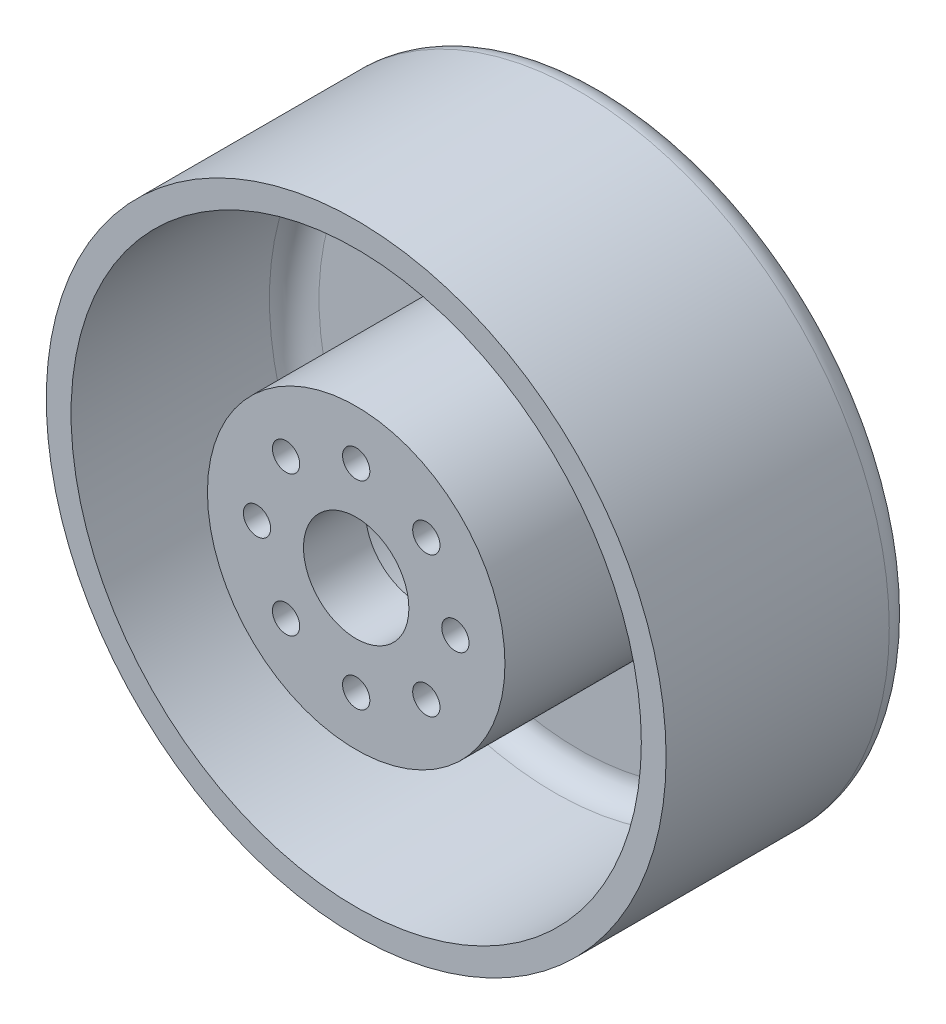
ISO-10303-21;
HEADER;
FILE_DESCRIPTION(('STEP AP214'),'2;1');
FILE_NAME('part.step','',(''),(''),'','','');
FILE_SCHEMA(('AUTOMOTIVE_DESIGN { 1 0 10303 214 1 1 1 1 }'));
ENDSEC;
DATA;
#1=APPLICATION_CONTEXT('core data for automotive mechanical design processes');
#2=APPLICATION_PROTOCOL_DEFINITION('international standard','automotive_design',2000,#1);
#3=PRODUCT_CONTEXT('',#1,'mechanical');
#4=PRODUCT('Part','Part','',(#3));
#5=PRODUCT_RELATED_PRODUCT_CATEGORY('part','',(#4));
#6=PRODUCT_DEFINITION_FORMATION('','',#4);
#7=PRODUCT_DEFINITION_CONTEXT('part definition',#1,'design');
#8=PRODUCT_DEFINITION('design','',#6,#7);
#9=PRODUCT_DEFINITION_SHAPE('','',#8);
#10=(LENGTH_UNIT() NAMED_UNIT(*) SI_UNIT(.MILLI.,.METRE.));
#11=(NAMED_UNIT(*) PLANE_ANGLE_UNIT() SI_UNIT($,.RADIAN.));
#12=(NAMED_UNIT(*) SI_UNIT($,.STERADIAN.) SOLID_ANGLE_UNIT());
#13=UNCERTAINTY_MEASURE_WITH_UNIT(LENGTH_MEASURE(1.E-05),#10,'distance_accuracy_value','');
#14=(GEOMETRIC_REPRESENTATION_CONTEXT(3) GLOBAL_UNCERTAINTY_ASSIGNED_CONTEXT((#13)) GLOBAL_UNIT_ASSIGNED_CONTEXT((#10,
#11,#12)) REPRESENTATION_CONTEXT('',''));
#15=CARTESIAN_POINT('',(0.,0.,0.));
#16=DIRECTION('',(0.,0.,1.));
#17=DIRECTION('',(1.,0.,0.));
#18=AXIS2_PLACEMENT_3D('',#15,#16,#17);
#19=CARTESIAN_POINT('',(0.,0.,20.));
#20=DIRECTION('',(0.,0.,1.));
#21=DIRECTION('',(1.,0.,0.));
#22=AXIS2_PLACEMENT_3D('',#19,#20,#21);
#23=PLANE('',#22);
#24=CARTESIAN_POINT('',(0.,0.,20.));
#25=DIRECTION('',(0.,0.,1.));
#26=DIRECTION('',(1.,0.,0.));
#27=AXIS2_PLACEMENT_3D('',#24,#25,#26);
#28=CIRCLE('',#27,4.25);
#29=CARTESIAN_POINT('',(4.25,0.,20.));
#30=VERTEX_POINT('',#29);
#31=EDGE_CURVE('E216',#30,#30,#28,.T.);
#32=ORIENTED_EDGE('',*,*,#31,.F.);
#33=EDGE_LOOP('',(#32));
#34=FACE_BOUND('',#33,.T.);
#35=CARTESIAN_POINT('',(5.65685424949228,5.65685424949214,20.));
#36=DIRECTION('',(0.,0.,-1.));
#37=DIRECTION('',(-1.,0.,0.));
#38=AXIS2_PLACEMENT_3D('',#35,#36,#37);
#39=CIRCLE('',#38,1.1);
#40=CARTESIAN_POINT('',(4.55685424949228,5.65685424949214,20.));
#41=VERTEX_POINT('',#40);
#42=EDGE_CURVE('E76',#41,#41,#39,.T.);
#43=ORIENTED_EDGE('',*,*,#42,.T.);
#44=EDGE_LOOP('',(#43));
#45=FACE_BOUND('',#44,.T.);
#46=CARTESIAN_POINT('',(7.99999999999966,-3.40570654445189E-13,20.));
#47=DIRECTION('',(0.,0.,-1.));
#48=DIRECTION('',(-1.,0.,0.));
#49=AXIS2_PLACEMENT_3D('',#46,#47,#48);
#50=CIRCLE('',#49,1.1);
#51=CARTESIAN_POINT('',(6.89999999999966,-3.40570654445189E-13,20.));
#52=VERTEX_POINT('',#51);
#53=EDGE_CURVE('E92',#52,#52,#50,.T.);
#54=ORIENTED_EDGE('',*,*,#53,.T.);
#55=EDGE_LOOP('',(#54));
#56=FACE_BOUND('',#55,.T.);
#57=CARTESIAN_POINT('',(5.6568542494918,-5.65685424949262,20.));
#58=DIRECTION('',(0.,0.,-1.));
#59=DIRECTION('',(-1.,0.,0.));
#60=AXIS2_PLACEMENT_3D('',#57,#58,#59);
#61=CIRCLE('',#60,1.1);
#62=CARTESIAN_POINT('',(4.5568542494918,-5.65685424949262,20.));
#63=VERTEX_POINT('',#62);
#64=EDGE_CURVE('E108',#63,#63,#61,.T.);
#65=ORIENTED_EDGE('',*,*,#64,.T.);
#66=EDGE_LOOP('',(#65));
#67=FACE_BOUND('',#66,.T.);
#68=CARTESIAN_POINT('',(-6.79181874011743E-13,-8.,20.));
#69=DIRECTION('',(0.,0.,-1.));
#70=DIRECTION('',(-1.,0.,0.));
#71=AXIS2_PLACEMENT_3D('',#68,#69,#70);
#72=CIRCLE('',#71,1.1);
#73=CARTESIAN_POINT('',(-1.10000000000068,-8.,20.));
#74=VERTEX_POINT('',#73);
#75=EDGE_CURVE('E124',#74,#74,#72,.T.);
#76=ORIENTED_EDGE('',*,*,#75,.T.);
#77=EDGE_LOOP('',(#76));
#78=FACE_BOUND('',#77,.T.);
#79=CARTESIAN_POINT('',(-5.65685424949296,-5.65685424949214,20.));
#80=DIRECTION('',(0.,0.,-1.));
#81=DIRECTION('',(-1.,0.,0.));
#82=AXIS2_PLACEMENT_3D('',#79,#80,#81);
#83=CIRCLE('',#82,1.1);
#84=CARTESIAN_POINT('',(-6.75685424949296,-5.65685424949214,20.));
#85=VERTEX_POINT('',#84);
#86=EDGE_CURVE('E140',#85,#85,#83,.T.);
#87=ORIENTED_EDGE('',*,*,#86,.T.);
#88=EDGE_LOOP('',(#87));
#89=FACE_BOUND('',#88,.T.);
#90=CARTESIAN_POINT('',(-8.00000000000034,3.39590937005871E-13,20.));
#91=DIRECTION('',(0.,0.,-1.));
#92=DIRECTION('',(-1.,0.,0.));
#93=AXIS2_PLACEMENT_3D('',#90,#91,#92);
#94=CIRCLE('',#93,1.1);
#95=CARTESIAN_POINT('',(-9.10000000000034,3.39590937005871E-13,20.));
#96=VERTEX_POINT('',#95);
#97=EDGE_CURVE('E156',#96,#96,#94,.T.);
#98=ORIENTED_EDGE('',*,*,#97,.T.);
#99=EDGE_LOOP('',(#98));
#100=FACE_BOUND('',#99,.T.);
#101=CARTESIAN_POINT('',(-5.65685424949248,5.65685424949262,20.));
#102=DIRECTION('',(0.,0.,-1.));
#103=DIRECTION('',(-1.,0.,0.));
#104=AXIS2_PLACEMENT_3D('',#101,#102,#103);
#105=CIRCLE('',#104,1.1);
#106=CARTESIAN_POINT('',(-6.75685424949248,5.65685424949262,20.));
#107=VERTEX_POINT('',#106);
#108=EDGE_CURVE('E172',#107,#107,#105,.T.);
#109=ORIENTED_EDGE('',*,*,#108,.T.);
#110=EDGE_LOOP('',(#109));
#111=FACE_BOUND('',#110,.T.);
#112=CARTESIAN_POINT('',(0.,8.,20.));
#113=DIRECTION('',(0.,0.,-1.));
#114=DIRECTION('',(-1.,0.,0.));
#115=AXIS2_PLACEMENT_3D('',#112,#113,#114);
#116=CIRCLE('',#115,1.1);
#117=CARTESIAN_POINT('',(-1.1,8.,20.));
#118=VERTEX_POINT('',#117);
#119=EDGE_CURVE('E188',#118,#118,#116,.T.);
#120=ORIENTED_EDGE('',*,*,#119,.T.);
#121=EDGE_LOOP('',(#120));
#122=FACE_BOUND('',#121,.T.);
#123=CARTESIAN_POINT('',(0.,0.,20.));
#124=DIRECTION('',(0.,0.,1.));
#125=DIRECTION('',(1.,0.,0.));
#126=AXIS2_PLACEMENT_3D('',#123,#124,#125);
#127=CIRCLE('',#126,12.);
#128=CARTESIAN_POINT('',(12.,0.,20.));
#129=VERTEX_POINT('',#128);
#130=EDGE_CURVE('E209',#129,#129,#127,.T.);
#131=ORIENTED_EDGE('',*,*,#130,.T.);
#132=EDGE_LOOP('',(#131));
#133=FACE_BOUND('',#132,.T.);
#134=ADVANCED_FACE('F36',(#34,#45,#56,#67,#78,#89,#100,#111,#122,#133),#23,.T.);
#135=CARTESIAN_POINT('',(0.,0.,20.));
#136=DIRECTION('',(0.,0.,-1.));
#137=DIRECTION('',(-1.,0.,0.));
#138=AXIS2_PLACEMENT_3D('',#135,#136,#137);
#139=CYLINDRICAL_SURFACE('',#138,25.);
#140=CARTESIAN_POINT('',(0.,0.,2.));
#141=DIRECTION('',(0.,0.,1.));
#142=DIRECTION('',(1.,0.,0.));
#143=AXIS2_PLACEMENT_3D('',#140,#141,#142);
#144=CIRCLE('',#143,25.);
#145=CARTESIAN_POINT('',(25.,0.,2.));
#146=VERTEX_POINT('',#145);
#147=EDGE_CURVE('E50',#146,#146,#144,.T.);
#148=ORIENTED_EDGE('',*,*,#147,.T.);
#149=EDGE_LOOP('',(#148));
#150=FACE_BOUND('',#149,.T.);
#151=CARTESIAN_POINT('',(0.,0.,20.));
#152=DIRECTION('',(0.,0.,1.));
#153=DIRECTION('',(1.,0.,0.));
#154=AXIS2_PLACEMENT_3D('',#151,#152,#153);
#155=CIRCLE('',#154,25.);
#156=CARTESIAN_POINT('',(25.,0.,20.));
#157=VERTEX_POINT('',#156);
#158=EDGE_CURVE('E68',#157,#157,#155,.T.);
#159=ORIENTED_EDGE('',*,*,#158,.F.);
#160=EDGE_LOOP('',(#159));
#161=FACE_BOUND('',#160,.T.);
#162=ADVANCED_FACE('F264',(#150,#161),#139,.T.);
#163=CARTESIAN_POINT('',(0.,0.,20.));
#164=DIRECTION('',(0.,0.,1.));
#165=DIRECTION('',(1.,0.,0.));
#166=AXIS2_PLACEMENT_3D('',#163,#164,#165);
#167=CIRCLE('',#166,23.);
#168=CARTESIAN_POINT('',(23.,0.,20.));
#169=VERTEX_POINT('',#168);
#170=EDGE_CURVE('E204',#169,#169,#167,.T.);
#171=ORIENTED_EDGE('',*,*,#170,.F.);
#172=EDGE_LOOP('',(#171));
#173=FACE_BOUND('',#172,.T.);
#174=ORIENTED_EDGE('',*,*,#158,.T.);
#175=EDGE_LOOP('',(#174));
#176=FACE_BOUND('',#175,.T.);
#177=ADVANCED_FACE('F259',(#173,#176),#23,.T.);
#178=CARTESIAN_POINT('',(0.,0.,0.));
#179=DIRECTION('',(0.,0.,1.));
#180=DIRECTION('',(1.,0.,0.));
#181=AXIS2_PLACEMENT_3D('',#178,#179,#180);
#182=PLANE('',#181);
#183=CARTESIAN_POINT('',(0.,0.,0.));
#184=DIRECTION('',(0.,0.,1.));
#185=DIRECTION('',(1.,0.,0.));
#186=AXIS2_PLACEMENT_3D('',#183,#184,#185);
#187=CIRCLE('',#186,13.);
#188=CARTESIAN_POINT('',(13.,0.,0.));
#189=VERTEX_POINT('',#188);
#190=EDGE_CURVE('E56',#189,#189,#187,.T.);
#191=ORIENTED_EDGE('',*,*,#190,.T.);
#192=EDGE_LOOP('',(#191));
#193=FACE_BOUND('',#192,.T.);
#194=CARTESIAN_POINT('',(0.,0.,0.));
#195=DIRECTION('',(0.,0.,1.));
#196=DIRECTION('',(1.,0.,0.));
#197=AXIS2_PLACEMENT_3D('',#194,#195,#196);
#198=CIRCLE('',#197,23.);
#199=CARTESIAN_POINT('',(23.,0.,0.));
#200=VERTEX_POINT('',#199);
#201=EDGE_CURVE('E60',#200,#200,#198,.F.);
#202=ORIENTED_EDGE('',*,*,#201,.T.);
#203=EDGE_LOOP('',(#202));
#204=FACE_BOUND('',#203,.T.);
#205=ADVANCED_FACE('F252',(#193,#204),#182,.F.);
#206=CARTESIAN_POINT('',(0.,0.,15.));
#207=DIRECTION('',(0.,0.,-1.));
#208=DIRECTION('',(-1.,0.,0.));
#209=AXIS2_PLACEMENT_3D('',#206,#207,#208);
#210=CYLINDRICAL_SURFACE('',#209,11.);
#211=CARTESIAN_POINT('',(0.,0.,2.));
#212=DIRECTION('',(0.,0.,1.));
#213=DIRECTION('',(1.,0.,0.));
#214=AXIS2_PLACEMENT_3D('',#211,#212,#213);
#215=CIRCLE('',#214,11.);
#216=CARTESIAN_POINT('',(11.,0.,2.));
#217=VERTEX_POINT('',#216);
#218=EDGE_CURVE('E64',#217,#217,#215,.F.);
#219=ORIENTED_EDGE('',*,*,#218,.T.);
#220=EDGE_LOOP('',(#219));
#221=FACE_BOUND('',#220,.T.);
#222=CARTESIAN_POINT('',(0.,0.,15.));
#223=DIRECTION('',(0.,0.,-1.));
#224=DIRECTION('',(-1.,0.,0.));
#225=AXIS2_PLACEMENT_3D('',#222,#223,#224);
#226=CIRCLE('',#225,11.);
#227=CARTESIAN_POINT('',(-11.,0.,15.));
#228=VERTEX_POINT('',#227);
#229=EDGE_CURVE('E72',#228,#228,#226,.T.);
#230=ORIENTED_EDGE('',*,*,#229,.F.);
#231=EDGE_LOOP('',(#230));
#232=FACE_BOUND('',#231,.T.);
#233=ADVANCED_FACE('F231',(#221,#232),#210,.F.);
#234=CARTESIAN_POINT('',(0.,0.,15.));
#235=DIRECTION('',(0.,0.,-1.));
#236=DIRECTION('',(-1.,0.,0.));
#237=AXIS2_PLACEMENT_3D('',#234,#235,#236);
#238=PLANE('',#237);
#239=CARTESIAN_POINT('',(0.,0.,15.));
#240=DIRECTION('',(0.,0.,-1.));
#241=DIRECTION('',(-1.,0.,0.));
#242=AXIS2_PLACEMENT_3D('',#239,#240,#241);
#243=CIRCLE('',#242,4.25);
#244=CARTESIAN_POINT('',(-4.25,0.,15.));
#245=VERTEX_POINT('',#244);
#246=EDGE_CURVE('E40',#245,#245,#243,.T.);
#247=ORIENTED_EDGE('',*,*,#246,.F.);
#248=EDGE_LOOP('',(#247));
#249=FACE_BOUND('',#248,.T.);
#250=CARTESIAN_POINT('',(0.,8.,15.));
#251=DIRECTION('',(0.,0.,-1.));
#252=DIRECTION('',(-1.,0.,0.));
#253=AXIS2_PLACEMENT_3D('',#250,#251,#252);
#254=CIRCLE('',#253,2.19999999999999);
#255=CARTESIAN_POINT('',(-2.19999999999999,8.,15.));
#256=VERTEX_POINT('',#255);
#257=EDGE_CURVE('E200',#256,#256,#254,.T.);
#258=ORIENTED_EDGE('',*,*,#257,.F.);
#259=EDGE_LOOP('',(#258));
#260=FACE_BOUND('',#259,.T.);
#261=CARTESIAN_POINT('',(-5.65685424949248,5.65685424949262,15.));
#262=DIRECTION('',(0.,0.,-1.));
#263=DIRECTION('',(-1.,0.,0.));
#264=AXIS2_PLACEMENT_3D('',#261,#262,#263);
#265=CIRCLE('',#264,2.19999999999999);
#266=CARTESIAN_POINT('',(-7.85685424949247,5.65685424949262,15.));
#267=VERTEX_POINT('',#266);
#268=EDGE_CURVE('E184',#267,#267,#265,.T.);
#269=ORIENTED_EDGE('',*,*,#268,.F.);
#270=EDGE_LOOP('',(#269));
#271=FACE_BOUND('',#270,.T.);
#272=CARTESIAN_POINT('',(-8.00000000000034,3.39590937005871E-13,15.));
#273=DIRECTION('',(0.,0.,-1.));
#274=DIRECTION('',(-1.,0.,0.));
#275=AXIS2_PLACEMENT_3D('',#272,#273,#274);
#276=CIRCLE('',#275,2.19999999999999);
#277=CARTESIAN_POINT('',(-10.2000000000003,3.39590937005871E-13,15.));
#278=VERTEX_POINT('',#277);
#279=EDGE_CURVE('E168',#278,#278,#276,.T.);
#280=ORIENTED_EDGE('',*,*,#279,.F.);
#281=EDGE_LOOP('',(#280));
#282=FACE_BOUND('',#281,.T.);
#283=CARTESIAN_POINT('',(-5.65685424949296,-5.65685424949214,15.));
#284=DIRECTION('',(0.,0.,-1.));
#285=DIRECTION('',(-1.,0.,0.));
#286=AXIS2_PLACEMENT_3D('',#283,#284,#285);
#287=CIRCLE('',#286,2.19999999999999);
#288=CARTESIAN_POINT('',(-7.85685424949295,-5.65685424949214,15.));
#289=VERTEX_POINT('',#288);
#290=EDGE_CURVE('E152',#289,#289,#287,.T.);
#291=ORIENTED_EDGE('',*,*,#290,.F.);
#292=EDGE_LOOP('',(#291));
#293=FACE_BOUND('',#292,.T.);
#294=CARTESIAN_POINT('',(-6.79181874011743E-13,-8.,15.));
#295=DIRECTION('',(0.,0.,-1.));
#296=DIRECTION('',(-1.,0.,0.));
#297=AXIS2_PLACEMENT_3D('',#294,#295,#296);
#298=CIRCLE('',#297,2.19999999999999);
#299=CARTESIAN_POINT('',(-2.20000000000067,-8.,15.));
#300=VERTEX_POINT('',#299);
#301=EDGE_CURVE('E136',#300,#300,#298,.T.);
#302=ORIENTED_EDGE('',*,*,#301,.F.);
#303=EDGE_LOOP('',(#302));
#304=FACE_BOUND('',#303,.T.);
#305=CARTESIAN_POINT('',(5.6568542494918,-5.65685424949262,15.));
#306=DIRECTION('',(0.,0.,-1.));
#307=DIRECTION('',(-1.,0.,0.));
#308=AXIS2_PLACEMENT_3D('',#305,#306,#307);
#309=CIRCLE('',#308,2.19999999999999);
#310=CARTESIAN_POINT('',(3.45685424949181,-5.65685424949262,15.));
#311=VERTEX_POINT('',#310);
#312=EDGE_CURVE('E120',#311,#311,#309,.T.);
#313=ORIENTED_EDGE('',*,*,#312,.F.);
#314=EDGE_LOOP('',(#313));
#315=FACE_BOUND('',#314,.T.);
#316=CARTESIAN_POINT('',(7.99999999999966,-3.40570654445189E-13,15.));
#317=DIRECTION('',(0.,0.,-1.));
#318=DIRECTION('',(-1.,0.,0.));
#319=AXIS2_PLACEMENT_3D('',#316,#317,#318);
#320=CIRCLE('',#319,2.19999999999999);
#321=CARTESIAN_POINT('',(5.79999999999967,-3.40570654445189E-13,15.));
#322=VERTEX_POINT('',#321);
#323=EDGE_CURVE('E104',#322,#322,#320,.T.);
#324=ORIENTED_EDGE('',*,*,#323,.F.);
#325=EDGE_LOOP('',(#324));
#326=FACE_BOUND('',#325,.T.);
#327=CARTESIAN_POINT('',(5.65685424949228,5.65685424949214,15.));
#328=DIRECTION('',(0.,0.,-1.));
#329=DIRECTION('',(-1.,0.,0.));
#330=AXIS2_PLACEMENT_3D('',#327,#328,#329);
#331=CIRCLE('',#330,2.19999999999999);
#332=CARTESIAN_POINT('',(3.45685424949229,5.65685424949214,15.));
#333=VERTEX_POINT('',#332);
#334=EDGE_CURVE('E88',#333,#333,#331,.T.);
#335=ORIENTED_EDGE('',*,*,#334,.F.);
#336=EDGE_LOOP('',(#335));
#337=FACE_BOUND('',#336,.T.);
#338=ORIENTED_EDGE('',*,*,#229,.T.);
#339=EDGE_LOOP('',(#338));
#340=FACE_BOUND('',#339,.T.);
#341=ADVANCED_FACE('F227',(#249,#260,#271,#282,#293,#304,#315,#326,#337,#340),#238,.T.);
#342=CARTESIAN_POINT('',(5.65685424949228,5.65685424949214,15.));
#343=DIRECTION('',(0.,0.,-1.));
#344=DIRECTION('',(-1.,0.,0.));
#345=AXIS2_PLACEMENT_3D('',#342,#343,#344);
#346=CYLINDRICAL_SURFACE('',#345,1.10000000000001);
#347=ORIENTED_EDGE('',*,*,#42,.F.);
#348=EDGE_LOOP('',(#347));
#349=FACE_BOUND('',#348,.T.);
#350=CARTESIAN_POINT('',(5.65685424949228,5.65685424949214,17.));
#351=DIRECTION('',(0.,0.,-1.));
#352=DIRECTION('',(-1.,0.,0.));
#353=AXIS2_PLACEMENT_3D('',#350,#351,#352);
#354=CIRCLE('',#353,1.10000000000001);
#355=CARTESIAN_POINT('',(4.55685424949227,5.65685424949214,17.));
#356=VERTEX_POINT('',#355);
#357=EDGE_CURVE('E80',#356,#356,#354,.T.);
#358=ORIENTED_EDGE('',*,*,#357,.T.);
#359=EDGE_LOOP('',(#358));
#360=FACE_BOUND('',#359,.T.);
#361=ADVANCED_FACE('F230',(#349,#360),#346,.F.);
#362=CARTESIAN_POINT('',(6.75685424949229,5.65685424949214,17.));
#363=DIRECTION('',(0.,0.,1.));
#364=DIRECTION('',(1.,0.,0.));
#365=AXIS2_PLACEMENT_3D('',#362,#363,#364);
#366=PLANE('',#365);
#367=ORIENTED_EDGE('',*,*,#357,.F.);
#368=EDGE_LOOP('',(#367));
#369=FACE_BOUND('',#368,.T.);
#370=CARTESIAN_POINT('',(5.65685424949228,5.65685424949214,17.));
#371=DIRECTION('',(0.,0.,-1.));
#372=DIRECTION('',(-1.,0.,0.));
#373=AXIS2_PLACEMENT_3D('',#370,#371,#372);
#374=CIRCLE('',#373,2.19999999999999);
#375=CARTESIAN_POINT('',(3.45685424949229,5.65685424949214,17.));
#376=VERTEX_POINT('',#375);
#377=EDGE_CURVE('E84',#376,#376,#374,.T.);
#378=ORIENTED_EDGE('',*,*,#377,.T.);
#379=EDGE_LOOP('',(#378));
#380=FACE_BOUND('',#379,.T.);
#381=ADVANCED_FACE('F383',(#369,#380),#366,.F.);
#382=CARTESIAN_POINT('',(5.65685424949228,5.65685424949214,15.));
#383=DIRECTION('',(0.,0.,-1.));
#384=DIRECTION('',(-1.,0.,0.));
#385=AXIS2_PLACEMENT_3D('',#382,#383,#384);
#386=CYLINDRICAL_SURFACE('',#385,2.19999999999999);
#387=ORIENTED_EDGE('',*,*,#377,.F.);
#388=EDGE_LOOP('',(#387));
#389=FACE_BOUND('',#388,.T.);
#390=ORIENTED_EDGE('',*,*,#334,.T.);
#391=EDGE_LOOP('',(#390));
#392=FACE_BOUND('',#391,.T.);
#393=ADVANCED_FACE('F379',(#389,#392),#386,.F.);
#394=CARTESIAN_POINT('',(7.99999999999966,-3.40570654445189E-13,15.));
#395=DIRECTION('',(0.,0.,-1.));
#396=DIRECTION('',(-1.,0.,0.));
#397=AXIS2_PLACEMENT_3D('',#394,#395,#396);
#398=CYLINDRICAL_SURFACE('',#397,1.10000000000001);
#399=ORIENTED_EDGE('',*,*,#53,.F.);
#400=EDGE_LOOP('',(#399));
#401=FACE_BOUND('',#400,.T.);
#402=CARTESIAN_POINT('',(7.99999999999966,-3.40570654445189E-13,17.));
#403=DIRECTION('',(0.,0.,-1.));
#404=DIRECTION('',(-1.,0.,0.));
#405=AXIS2_PLACEMENT_3D('',#402,#403,#404);
#406=CIRCLE('',#405,1.10000000000001);
#407=CARTESIAN_POINT('',(6.89999999999965,-3.40570654445189E-13,17.));
#408=VERTEX_POINT('',#407);
#409=EDGE_CURVE('E96',#408,#408,#406,.T.);
#410=ORIENTED_EDGE('',*,*,#409,.T.);
#411=EDGE_LOOP('',(#410));
#412=FACE_BOUND('',#411,.T.);
#413=ADVANCED_FACE('F375',(#401,#412),#398,.F.);
#414=CARTESIAN_POINT('',(9.09999999999967,-3.40570654445189E-13,17.));
#415=DIRECTION('',(0.,0.,1.));
#416=DIRECTION('',(1.,0.,0.));
#417=AXIS2_PLACEMENT_3D('',#414,#415,#416);
#418=PLANE('',#417);
#419=ORIENTED_EDGE('',*,*,#409,.F.);
#420=EDGE_LOOP('',(#419));
#421=FACE_BOUND('',#420,.T.);
#422=CARTESIAN_POINT('',(7.99999999999966,-3.40570654445189E-13,17.));
#423=DIRECTION('',(0.,0.,-1.));
#424=DIRECTION('',(-1.,0.,0.));
#425=AXIS2_PLACEMENT_3D('',#422,#423,#424);
#426=CIRCLE('',#425,2.19999999999999);
#427=CARTESIAN_POINT('',(5.79999999999967,-3.40570654445189E-13,17.));
#428=VERTEX_POINT('',#427);
#429=EDGE_CURVE('E100',#428,#428,#426,.T.);
#430=ORIENTED_EDGE('',*,*,#429,.T.);
#431=EDGE_LOOP('',(#430));
#432=FACE_BOUND('',#431,.T.);
#433=ADVANCED_FACE('F371',(#421,#432),#418,.F.);
#434=CARTESIAN_POINT('',(7.99999999999966,-3.40570654445189E-13,15.));
#435=DIRECTION('',(0.,0.,-1.));
#436=DIRECTION('',(-1.,0.,0.));
#437=AXIS2_PLACEMENT_3D('',#434,#435,#436);
#438=CYLINDRICAL_SURFACE('',#437,2.19999999999999);
#439=ORIENTED_EDGE('',*,*,#429,.F.);
#440=EDGE_LOOP('',(#439));
#441=FACE_BOUND('',#440,.T.);
#442=ORIENTED_EDGE('',*,*,#323,.T.);
#443=EDGE_LOOP('',(#442));
#444=FACE_BOUND('',#443,.T.);
#445=ADVANCED_FACE('F367',(#441,#444),#438,.F.);
#446=CARTESIAN_POINT('',(5.6568542494918,-5.65685424949262,15.));
#447=DIRECTION('',(0.,0.,-1.));
#448=DIRECTION('',(-1.,0.,0.));
#449=AXIS2_PLACEMENT_3D('',#446,#447,#448);
#450=CYLINDRICAL_SURFACE('',#449,1.10000000000001);
#451=ORIENTED_EDGE('',*,*,#64,.F.);
#452=EDGE_LOOP('',(#451));
#453=FACE_BOUND('',#452,.T.);
#454=CARTESIAN_POINT('',(5.6568542494918,-5.65685424949262,17.));
#455=DIRECTION('',(0.,0.,-1.));
#456=DIRECTION('',(-1.,0.,0.));
#457=AXIS2_PLACEMENT_3D('',#454,#455,#456);
#458=CIRCLE('',#457,1.10000000000001);
#459=CARTESIAN_POINT('',(4.55685424949179,-5.65685424949262,17.));
#460=VERTEX_POINT('',#459);
#461=EDGE_CURVE('E112',#460,#460,#458,.T.);
#462=ORIENTED_EDGE('',*,*,#461,.T.);
#463=EDGE_LOOP('',(#462));
#464=FACE_BOUND('',#463,.T.);
#465=ADVANCED_FACE('F363',(#453,#464),#450,.F.);
#466=CARTESIAN_POINT('',(6.75685424949181,-5.65685424949262,17.));
#467=DIRECTION('',(0.,0.,1.));
#468=DIRECTION('',(1.,0.,0.));
#469=AXIS2_PLACEMENT_3D('',#466,#467,#468);
#470=PLANE('',#469);
#471=ORIENTED_EDGE('',*,*,#461,.F.);
#472=EDGE_LOOP('',(#471));
#473=FACE_BOUND('',#472,.T.);
#474=CARTESIAN_POINT('',(5.6568542494918,-5.65685424949262,17.));
#475=DIRECTION('',(0.,0.,-1.));
#476=DIRECTION('',(-1.,0.,0.));
#477=AXIS2_PLACEMENT_3D('',#474,#475,#476);
#478=CIRCLE('',#477,2.19999999999999);
#479=CARTESIAN_POINT('',(3.45685424949181,-5.65685424949262,17.));
#480=VERTEX_POINT('',#479);
#481=EDGE_CURVE('E116',#480,#480,#478,.T.);
#482=ORIENTED_EDGE('',*,*,#481,.T.);
#483=EDGE_LOOP('',(#482));
#484=FACE_BOUND('',#483,.T.);
#485=ADVANCED_FACE('F359',(#473,#484),#470,.F.);
#486=CARTESIAN_POINT('',(5.6568542494918,-5.65685424949262,15.));
#487=DIRECTION('',(0.,0.,-1.));
#488=DIRECTION('',(-1.,0.,0.));
#489=AXIS2_PLACEMENT_3D('',#486,#487,#488);
#490=CYLINDRICAL_SURFACE('',#489,2.19999999999999);
#491=ORIENTED_EDGE('',*,*,#481,.F.);
#492=EDGE_LOOP('',(#491));
#493=FACE_BOUND('',#492,.T.);
#494=ORIENTED_EDGE('',*,*,#312,.T.);
#495=EDGE_LOOP('',(#494));
#496=FACE_BOUND('',#495,.T.);
#497=ADVANCED_FACE('F355',(#493,#496),#490,.F.);
#498=CARTESIAN_POINT('',(-6.79181874011743E-13,-8.,15.));
#499=DIRECTION('',(0.,0.,-1.));
#500=DIRECTION('',(-1.,0.,0.));
#501=AXIS2_PLACEMENT_3D('',#498,#499,#500);
#502=CYLINDRICAL_SURFACE('',#501,1.10000000000001);
#503=ORIENTED_EDGE('',*,*,#75,.F.);
#504=EDGE_LOOP('',(#503));
#505=FACE_BOUND('',#504,.T.);
#506=CARTESIAN_POINT('',(-6.79181874011743E-13,-8.,17.));
#507=DIRECTION('',(0.,0.,-1.));
#508=DIRECTION('',(-1.,0.,0.));
#509=AXIS2_PLACEMENT_3D('',#506,#507,#508);
#510=CIRCLE('',#509,1.10000000000001);
#511=CARTESIAN_POINT('',(-1.10000000000069,-8.,17.));
#512=VERTEX_POINT('',#511);
#513=EDGE_CURVE('E128',#512,#512,#510,.T.);
#514=ORIENTED_EDGE('',*,*,#513,.T.);
#515=EDGE_LOOP('',(#514));
#516=FACE_BOUND('',#515,.T.);
#517=ADVANCED_FACE('F351',(#505,#516),#502,.F.);
#518=CARTESIAN_POINT('',(1.09999999999933,-8.,17.));
#519=DIRECTION('',(0.,0.,1.));
#520=DIRECTION('',(1.,0.,0.));
#521=AXIS2_PLACEMENT_3D('',#518,#519,#520);
#522=PLANE('',#521);
#523=ORIENTED_EDGE('',*,*,#513,.F.);
#524=EDGE_LOOP('',(#523));
#525=FACE_BOUND('',#524,.T.);
#526=CARTESIAN_POINT('',(-6.79181874011743E-13,-8.,17.));
#527=DIRECTION('',(0.,0.,-1.));
#528=DIRECTION('',(-1.,0.,0.));
#529=AXIS2_PLACEMENT_3D('',#526,#527,#528);
#530=CIRCLE('',#529,2.19999999999999);
#531=CARTESIAN_POINT('',(-2.20000000000067,-8.,17.));
#532=VERTEX_POINT('',#531);
#533=EDGE_CURVE('E132',#532,#532,#530,.T.);
#534=ORIENTED_EDGE('',*,*,#533,.T.);
#535=EDGE_LOOP('',(#534));
#536=FACE_BOUND('',#535,.T.);
#537=ADVANCED_FACE('F347',(#525,#536),#522,.F.);
#538=CARTESIAN_POINT('',(-6.79181874011743E-13,-8.,15.));
#539=DIRECTION('',(0.,0.,-1.));
#540=DIRECTION('',(-1.,0.,0.));
#541=AXIS2_PLACEMENT_3D('',#538,#539,#540);
#542=CYLINDRICAL_SURFACE('',#541,2.19999999999999);
#543=ORIENTED_EDGE('',*,*,#533,.F.);
#544=EDGE_LOOP('',(#543));
#545=FACE_BOUND('',#544,.T.);
#546=ORIENTED_EDGE('',*,*,#301,.T.);
#547=EDGE_LOOP('',(#546));
#548=FACE_BOUND('',#547,.T.);
#549=ADVANCED_FACE('F343',(#545,#548),#542,.F.);
#550=CARTESIAN_POINT('',(-5.65685424949296,-5.65685424949214,15.));
#551=DIRECTION('',(0.,0.,-1.));
#552=DIRECTION('',(-1.,0.,0.));
#553=AXIS2_PLACEMENT_3D('',#550,#551,#552);
#554=CYLINDRICAL_SURFACE('',#553,1.10000000000001);
#555=ORIENTED_EDGE('',*,*,#86,.F.);
#556=EDGE_LOOP('',(#555));
#557=FACE_BOUND('',#556,.T.);
#558=CARTESIAN_POINT('',(-5.65685424949296,-5.65685424949214,17.));
#559=DIRECTION('',(0.,0.,-1.));
#560=DIRECTION('',(-1.,0.,0.));
#561=AXIS2_PLACEMENT_3D('',#558,#559,#560);
#562=CIRCLE('',#561,1.10000000000001);
#563=CARTESIAN_POINT('',(-6.75685424949297,-5.65685424949214,17.));
#564=VERTEX_POINT('',#563);
#565=EDGE_CURVE('E144',#564,#564,#562,.T.);
#566=ORIENTED_EDGE('',*,*,#565,.T.);
#567=EDGE_LOOP('',(#566));
#568=FACE_BOUND('',#567,.T.);
#569=ADVANCED_FACE('F339',(#557,#568),#554,.F.);
#570=CARTESIAN_POINT('',(-4.55685424949295,-5.65685424949214,17.));
#571=DIRECTION('',(0.,0.,1.));
#572=DIRECTION('',(1.,0.,0.));
#573=AXIS2_PLACEMENT_3D('',#570,#571,#572);
#574=PLANE('',#573);
#575=ORIENTED_EDGE('',*,*,#565,.F.);
#576=EDGE_LOOP('',(#575));
#577=FACE_BOUND('',#576,.T.);
#578=CARTESIAN_POINT('',(-5.65685424949296,-5.65685424949214,17.));
#579=DIRECTION('',(0.,0.,-1.));
#580=DIRECTION('',(-1.,0.,0.));
#581=AXIS2_PLACEMENT_3D('',#578,#579,#580);
#582=CIRCLE('',#581,2.19999999999999);
#583=CARTESIAN_POINT('',(-7.85685424949295,-5.65685424949214,17.));
#584=VERTEX_POINT('',#583);
#585=EDGE_CURVE('E148',#584,#584,#582,.T.);
#586=ORIENTED_EDGE('',*,*,#585,.T.);
#587=EDGE_LOOP('',(#586));
#588=FACE_BOUND('',#587,.T.);
#589=ADVANCED_FACE('F335',(#577,#588),#574,.F.);
#590=CARTESIAN_POINT('',(-5.65685424949296,-5.65685424949214,15.));
#591=DIRECTION('',(0.,0.,-1.));
#592=DIRECTION('',(-1.,0.,0.));
#593=AXIS2_PLACEMENT_3D('',#590,#591,#592);
#594=CYLINDRICAL_SURFACE('',#593,2.19999999999999);
#595=ORIENTED_EDGE('',*,*,#585,.F.);
#596=EDGE_LOOP('',(#595));
#597=FACE_BOUND('',#596,.T.);
#598=ORIENTED_EDGE('',*,*,#290,.T.);
#599=EDGE_LOOP('',(#598));
#600=FACE_BOUND('',#599,.T.);
#601=ADVANCED_FACE('F331',(#597,#600),#594,.F.);
#602=CARTESIAN_POINT('',(-8.00000000000034,3.39590937005871E-13,15.));
#603=DIRECTION('',(0.,0.,-1.));
#604=DIRECTION('',(-1.,0.,0.));
#605=AXIS2_PLACEMENT_3D('',#602,#603,#604);
#606=CYLINDRICAL_SURFACE('',#605,1.10000000000001);
#607=ORIENTED_EDGE('',*,*,#97,.F.);
#608=EDGE_LOOP('',(#607));
#609=FACE_BOUND('',#608,.T.);
#610=CARTESIAN_POINT('',(-8.00000000000034,3.39590937005871E-13,17.));
#611=DIRECTION('',(0.,0.,-1.));
#612=DIRECTION('',(-1.,0.,0.));
#613=AXIS2_PLACEMENT_3D('',#610,#611,#612);
#614=CIRCLE('',#613,1.10000000000001);
#615=CARTESIAN_POINT('',(-9.10000000000035,3.39590937005871E-13,17.));
#616=VERTEX_POINT('',#615);
#617=EDGE_CURVE('E160',#616,#616,#614,.T.);
#618=ORIENTED_EDGE('',*,*,#617,.T.);
#619=EDGE_LOOP('',(#618));
#620=FACE_BOUND('',#619,.T.);
#621=ADVANCED_FACE('F327',(#609,#620),#606,.F.);
#622=CARTESIAN_POINT('',(-6.90000000000033,3.39590937005871E-13,17.));
#623=DIRECTION('',(0.,0.,1.));
#624=DIRECTION('',(1.,0.,0.));
#625=AXIS2_PLACEMENT_3D('',#622,#623,#624);
#626=PLANE('',#625);
#627=ORIENTED_EDGE('',*,*,#617,.F.);
#628=EDGE_LOOP('',(#627));
#629=FACE_BOUND('',#628,.T.);
#630=CARTESIAN_POINT('',(-8.00000000000034,3.39590937005871E-13,17.));
#631=DIRECTION('',(0.,0.,-1.));
#632=DIRECTION('',(-1.,0.,0.));
#633=AXIS2_PLACEMENT_3D('',#630,#631,#632);
#634=CIRCLE('',#633,2.19999999999999);
#635=CARTESIAN_POINT('',(-10.2000000000003,3.39590937005871E-13,17.));
#636=VERTEX_POINT('',#635);
#637=EDGE_CURVE('E164',#636,#636,#634,.T.);
#638=ORIENTED_EDGE('',*,*,#637,.T.);
#639=EDGE_LOOP('',(#638));
#640=FACE_BOUND('',#639,.T.);
#641=ADVANCED_FACE('F323',(#629,#640),#626,.F.);
#642=CARTESIAN_POINT('',(-8.00000000000034,3.39590937005871E-13,15.));
#643=DIRECTION('',(0.,0.,-1.));
#644=DIRECTION('',(-1.,0.,0.));
#645=AXIS2_PLACEMENT_3D('',#642,#643,#644);
#646=CYLINDRICAL_SURFACE('',#645,2.19999999999999);
#647=ORIENTED_EDGE('',*,*,#637,.F.);
#648=EDGE_LOOP('',(#647));
#649=FACE_BOUND('',#648,.T.);
#650=ORIENTED_EDGE('',*,*,#279,.T.);
#651=EDGE_LOOP('',(#650));
#652=FACE_BOUND('',#651,.T.);
#653=ADVANCED_FACE('F319',(#649,#652),#646,.F.);
#654=CARTESIAN_POINT('',(-5.65685424949248,5.65685424949262,15.));
#655=DIRECTION('',(0.,0.,-1.));
#656=DIRECTION('',(-1.,0.,0.));
#657=AXIS2_PLACEMENT_3D('',#654,#655,#656);
#658=CYLINDRICAL_SURFACE('',#657,1.10000000000001);
#659=ORIENTED_EDGE('',*,*,#108,.F.);
#660=EDGE_LOOP('',(#659));
#661=FACE_BOUND('',#660,.T.);
#662=CARTESIAN_POINT('',(-5.65685424949248,5.65685424949262,17.));
#663=DIRECTION('',(0.,0.,-1.));
#664=DIRECTION('',(-1.,0.,0.));
#665=AXIS2_PLACEMENT_3D('',#662,#663,#664);
#666=CIRCLE('',#665,1.10000000000001);
#667=CARTESIAN_POINT('',(-6.75685424949249,5.65685424949262,17.));
#668=VERTEX_POINT('',#667);
#669=EDGE_CURVE('E176',#668,#668,#666,.T.);
#670=ORIENTED_EDGE('',*,*,#669,.T.);
#671=EDGE_LOOP('',(#670));
#672=FACE_BOUND('',#671,.T.);
#673=ADVANCED_FACE('F315',(#661,#672),#658,.F.);
#674=CARTESIAN_POINT('',(-4.55685424949247,5.65685424949262,17.));
#675=DIRECTION('',(0.,0.,1.));
#676=DIRECTION('',(1.,0.,0.));
#677=AXIS2_PLACEMENT_3D('',#674,#675,#676);
#678=PLANE('',#677);
#679=ORIENTED_EDGE('',*,*,#669,.F.);
#680=EDGE_LOOP('',(#679));
#681=FACE_BOUND('',#680,.T.);
#682=CARTESIAN_POINT('',(-5.65685424949248,5.65685424949262,17.));
#683=DIRECTION('',(0.,0.,-1.));
#684=DIRECTION('',(-1.,0.,0.));
#685=AXIS2_PLACEMENT_3D('',#682,#683,#684);
#686=CIRCLE('',#685,2.19999999999999);
#687=CARTESIAN_POINT('',(-7.85685424949247,5.65685424949262,17.));
#688=VERTEX_POINT('',#687);
#689=EDGE_CURVE('E180',#688,#688,#686,.T.);
#690=ORIENTED_EDGE('',*,*,#689,.T.);
#691=EDGE_LOOP('',(#690));
#692=FACE_BOUND('',#691,.T.);
#693=ADVANCED_FACE('F311',(#681,#692),#678,.F.);
#694=CARTESIAN_POINT('',(-5.65685424949248,5.65685424949262,15.));
#695=DIRECTION('',(0.,0.,-1.));
#696=DIRECTION('',(-1.,0.,0.));
#697=AXIS2_PLACEMENT_3D('',#694,#695,#696);
#698=CYLINDRICAL_SURFACE('',#697,2.19999999999999);
#699=ORIENTED_EDGE('',*,*,#689,.F.);
#700=EDGE_LOOP('',(#699));
#701=FACE_BOUND('',#700,.T.);
#702=ORIENTED_EDGE('',*,*,#268,.T.);
#703=EDGE_LOOP('',(#702));
#704=FACE_BOUND('',#703,.T.);
#705=ADVANCED_FACE('F307',(#701,#704),#698,.F.);
#706=CARTESIAN_POINT('',(0.,8.,15.));
#707=DIRECTION('',(0.,0.,-1.));
#708=DIRECTION('',(-1.,0.,0.));
#709=AXIS2_PLACEMENT_3D('',#706,#707,#708);
#710=CYLINDRICAL_SURFACE('',#709,1.10000000000001);
#711=ORIENTED_EDGE('',*,*,#119,.F.);
#712=EDGE_LOOP('',(#711));
#713=FACE_BOUND('',#712,.T.);
#714=CARTESIAN_POINT('',(0.,8.,17.));
#715=DIRECTION('',(0.,0.,-1.));
#716=DIRECTION('',(-1.,0.,0.));
#717=AXIS2_PLACEMENT_3D('',#714,#715,#716);
#718=CIRCLE('',#717,1.10000000000001);
#719=CARTESIAN_POINT('',(-1.10000000000001,8.,17.));
#720=VERTEX_POINT('',#719);
#721=EDGE_CURVE('E192',#720,#720,#718,.T.);
#722=ORIENTED_EDGE('',*,*,#721,.T.);
#723=EDGE_LOOP('',(#722));
#724=FACE_BOUND('',#723,.T.);
#725=ADVANCED_FACE('F303',(#713,#724),#710,.F.);
#726=CARTESIAN_POINT('',(1.10000000000001,8.,17.));
#727=DIRECTION('',(0.,0.,1.));
#728=DIRECTION('',(1.,0.,0.));
#729=AXIS2_PLACEMENT_3D('',#726,#727,#728);
#730=PLANE('',#729);
#731=ORIENTED_EDGE('',*,*,#721,.F.);
#732=EDGE_LOOP('',(#731));
#733=FACE_BOUND('',#732,.T.);
#734=CARTESIAN_POINT('',(0.,8.,17.));
#735=DIRECTION('',(0.,0.,-1.));
#736=DIRECTION('',(-1.,0.,0.));
#737=AXIS2_PLACEMENT_3D('',#734,#735,#736);
#738=CIRCLE('',#737,2.19999999999999);
#739=CARTESIAN_POINT('',(-2.19999999999999,8.,17.));
#740=VERTEX_POINT('',#739);
#741=EDGE_CURVE('E196',#740,#740,#738,.T.);
#742=ORIENTED_EDGE('',*,*,#741,.T.);
#743=EDGE_LOOP('',(#742));
#744=FACE_BOUND('',#743,.T.);
#745=ADVANCED_FACE('F296',(#733,#744),#730,.F.);
#746=CARTESIAN_POINT('',(0.,8.,15.));
#747=DIRECTION('',(0.,0.,-1.));
#748=DIRECTION('',(-1.,0.,0.));
#749=AXIS2_PLACEMENT_3D('',#746,#747,#748);
#750=CYLINDRICAL_SURFACE('',#749,2.19999999999999);
#751=ORIENTED_EDGE('',*,*,#741,.F.);
#752=EDGE_LOOP('',(#751));
#753=FACE_BOUND('',#752,.T.);
#754=ORIENTED_EDGE('',*,*,#257,.T.);
#755=EDGE_LOOP('',(#754));
#756=FACE_BOUND('',#755,.T.);
#757=ADVANCED_FACE('F287',(#753,#756),#750,.F.);
#758=CARTESIAN_POINT('',(0.,0.,2.));
#759=DIRECTION('',(0.,0.,1.));
#760=DIRECTION('',(1.,0.,0.));
#761=AXIS2_PLACEMENT_3D('',#758,#759,#760);
#762=CYLINDRICAL_SURFACE('',#761,23.);
#763=CARTESIAN_POINT('',(0.,0.,4.));
#764=DIRECTION('',(0.,0.,1.));
#765=DIRECTION('',(1.,0.,0.));
#766=AXIS2_PLACEMENT_3D('',#763,#764,#765);
#767=CIRCLE('',#766,23.);
#768=CARTESIAN_POINT('',(23.,0.,4.));
#769=VERTEX_POINT('',#768);
#770=EDGE_CURVE('E10',#769,#769,#767,.F.);
#771=ORIENTED_EDGE('',*,*,#770,.T.);
#772=EDGE_LOOP('',(#771));
#773=FACE_BOUND('',#772,.T.);
#774=ORIENTED_EDGE('',*,*,#170,.T.);
#775=EDGE_LOOP('',(#774));
#776=FACE_BOUND('',#775,.T.);
#777=ADVANCED_FACE('F284',(#773,#776),#762,.F.);
#778=CARTESIAN_POINT('',(0.,0.,2.));
#779=DIRECTION('',(0.,0.,1.));
#780=DIRECTION('',(1.,0.,0.));
#781=AXIS2_PLACEMENT_3D('',#778,#779,#780);
#782=PLANE('',#781);
#783=CARTESIAN_POINT('',(0.,0.,2.));
#784=DIRECTION('',(0.,0.,1.));
#785=DIRECTION('',(1.,0.,0.));
#786=AXIS2_PLACEMENT_3D('',#783,#784,#785);
#787=CIRCLE('',#786,21.);
#788=CARTESIAN_POINT('',(21.,0.,2.));
#789=VERTEX_POINT('',#788);
#790=EDGE_CURVE('E45',#789,#789,#787,.T.);
#791=ORIENTED_EDGE('',*,*,#790,.T.);
#792=EDGE_LOOP('',(#791));
#793=FACE_BOUND('',#792,.T.);
#794=CARTESIAN_POINT('',(0.,0.,2.));
#795=DIRECTION('',(0.,0.,1.));
#796=DIRECTION('',(1.,0.,0.));
#797=AXIS2_PLACEMENT_3D('',#794,#795,#796);
#798=CIRCLE('',#797,12.);
#799=CARTESIAN_POINT('',(12.,0.,2.));
#800=VERTEX_POINT('',#799);
#801=EDGE_CURVE('E208',#800,#800,#798,.T.);
#802=ORIENTED_EDGE('',*,*,#801,.F.);
#803=EDGE_LOOP('',(#802));
#804=FACE_BOUND('',#803,.T.);
#805=ADVANCED_FACE('F286',(#793,#804),#782,.T.);
#806=CARTESIAN_POINT('',(0.,0.,2.));
#807=DIRECTION('',(0.,0.,1.));
#808=DIRECTION('',(1.,0.,0.));
#809=AXIS2_PLACEMENT_3D('',#806,#807,#808);
#810=CYLINDRICAL_SURFACE('',#809,12.);
#811=ORIENTED_EDGE('',*,*,#801,.T.);
#812=EDGE_LOOP('',(#811));
#813=FACE_BOUND('',#812,.T.);
#814=ORIENTED_EDGE('',*,*,#130,.F.);
#815=EDGE_LOOP('',(#814));
#816=FACE_BOUND('',#815,.T.);
#817=ADVANCED_FACE('F292',(#813,#816),#810,.T.);
#818=CARTESIAN_POINT('',(0.,0.,2.));
#819=DIRECTION('',(0.,0.,1.));
#820=DIRECTION('',(1.,0.,0.));
#821=AXIS2_PLACEMENT_3D('',#818,#819,#820);
#822=TOROIDAL_SURFACE('',#821,13.,2.);
#823=ORIENTED_EDGE('',*,*,#190,.F.);
#824=EDGE_LOOP('',(#823));
#825=FACE_BOUND('',#824,.T.);
#826=ORIENTED_EDGE('',*,*,#218,.F.);
#827=EDGE_LOOP('',(#826));
#828=FACE_BOUND('',#827,.T.);
#829=ADVANCED_FACE('F417',(#825,#828),#822,.T.);
#830=CARTESIAN_POINT('',(0.,0.,2.));
#831=DIRECTION('',(0.,0.,1.));
#832=DIRECTION('',(1.,0.,0.));
#833=AXIS2_PLACEMENT_3D('',#830,#831,#832);
#834=TOROIDAL_SURFACE('',#833,23.,2.);
#835=ORIENTED_EDGE('',*,*,#201,.F.);
#836=EDGE_LOOP('',(#835));
#837=FACE_BOUND('',#836,.T.);
#838=ORIENTED_EDGE('',*,*,#147,.F.);
#839=EDGE_LOOP('',(#838));
#840=FACE_BOUND('',#839,.T.);
#841=ADVANCED_FACE('F421',(#837,#840),#834,.T.);
#842=CARTESIAN_POINT('',(0.,0.,4.));
#843=DIRECTION('',(0.,0.,1.));
#844=DIRECTION('',(1.,0.,0.));
#845=AXIS2_PLACEMENT_3D('',#842,#843,#844);
#846=TOROIDAL_SURFACE('',#845,21.,2.);
#847=ORIENTED_EDGE('',*,*,#770,.F.);
#848=EDGE_LOOP('',(#847));
#849=FACE_BOUND('',#848,.T.);
#850=ORIENTED_EDGE('',*,*,#790,.F.);
#851=EDGE_LOOP('',(#850));
#852=FACE_BOUND('',#851,.T.);
#853=ADVANCED_FACE('F38',(#849,#852),#846,.F.);
#854=CARTESIAN_POINT('',(0.,0.,2.));
#855=DIRECTION('',(0.,0.,1.));
#856=DIRECTION('',(1.,0.,0.));
#857=AXIS2_PLACEMENT_3D('',#854,#855,#856);
#858=CYLINDRICAL_SURFACE('',#857,4.25);
#859=ORIENTED_EDGE('',*,*,#246,.T.);
#860=EDGE_LOOP('',(#859));
#861=FACE_BOUND('',#860,.T.);
#862=ORIENTED_EDGE('',*,*,#31,.T.);
#863=EDGE_LOOP('',(#862));
#864=FACE_BOUND('',#863,.T.);
#865=ADVANCED_FACE('F225',(#861,#864),#858,.F.);
#866=CLOSED_SHELL('',(#134,#162,#177,#205,#233,#341,#361,#381,#393,#413,#433,#445,#465,#485,
#497,#517,#537,#549,#569,#589,#601,#621,#641,#653,#673,#693,#705,#725,#745,#757,#777,#805,#817,
#829,#841,#853,#865));
#867=MANIFOLD_SOLID_BREP('B2',#866);
#868=ADVANCED_BREP_SHAPE_REPRESENTATION('',(#18,#867),#14);
#869=SHAPE_DEFINITION_REPRESENTATION(#9,#868);
ENDSEC;
END-ISO-10303-21;
